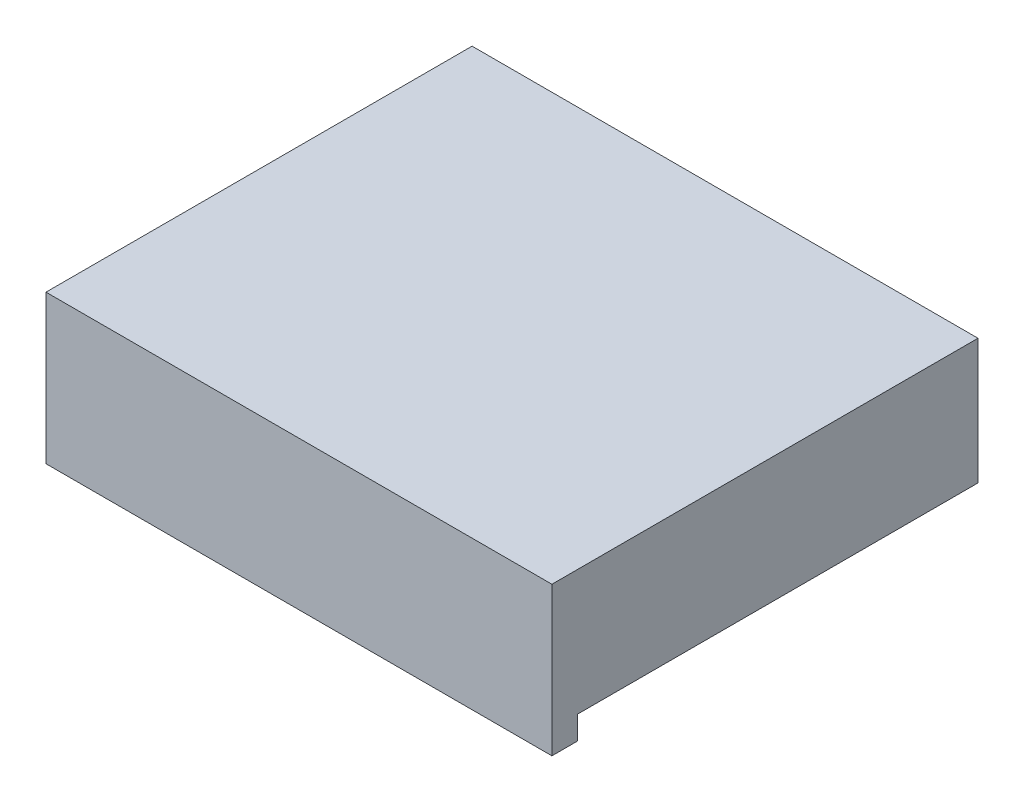
ISO-10303-21;
HEADER;
FILE_DESCRIPTION(('STEP AP214'),'2;1');
FILE_NAME('part.step','',(''),(''),'','','');
FILE_SCHEMA(('AUTOMOTIVE_DESIGN { 1 0 10303 214 1 1 1 1 }'));
ENDSEC;
DATA;
#1=APPLICATION_CONTEXT('core data for automotive mechanical design processes');
#2=APPLICATION_PROTOCOL_DEFINITION('international standard','automotive_design',2000,#1);
#3=PRODUCT_CONTEXT('',#1,'mechanical');
#4=PRODUCT('Part','Part','',(#3));
#5=PRODUCT_RELATED_PRODUCT_CATEGORY('part','',(#4));
#6=PRODUCT_DEFINITION_FORMATION('','',#4);
#7=PRODUCT_DEFINITION_CONTEXT('part definition',#1,'design');
#8=PRODUCT_DEFINITION('design','',#6,#7);
#9=PRODUCT_DEFINITION_SHAPE('','',#8);
#10=(LENGTH_UNIT() NAMED_UNIT(*) SI_UNIT(.MILLI.,.METRE.));
#11=(NAMED_UNIT(*) PLANE_ANGLE_UNIT() SI_UNIT($,.RADIAN.));
#12=(NAMED_UNIT(*) SI_UNIT($,.STERADIAN.) SOLID_ANGLE_UNIT());
#13=UNCERTAINTY_MEASURE_WITH_UNIT(LENGTH_MEASURE(1.E-05),#10,'distance_accuracy_value','');
#14=(GEOMETRIC_REPRESENTATION_CONTEXT(3) GLOBAL_UNCERTAINTY_ASSIGNED_CONTEXT((#13)) GLOBAL_UNIT_ASSIGNED_CONTEXT((#10,
#11,#12)) REPRESENTATION_CONTEXT('',''));
#15=CARTESIAN_POINT('',(0.,0.,0.));
#16=DIRECTION('',(0.,0.,1.));
#17=DIRECTION('',(1.,0.,0.));
#18=AXIS2_PLACEMENT_3D('',#15,#16,#17);
#19=CARTESIAN_POINT('',(109.,0.,0.));
#20=DIRECTION('',(0.,0.,1.));
#21=DIRECTION('',(1.,0.,0.));
#22=AXIS2_PLACEMENT_3D('',#19,#20,#21);
#23=PLANE('',#22);
#24=DIRECTION('',(0.,1.,0.));
#25=VECTOR('',#24,1.);
#26=CARTESIAN_POINT('',(0.,0.,0.));
#27=LINE('',#26,#25);
#28=CARTESIAN_POINT('',(0.,0.,0.));
#29=VERTEX_POINT('',#28);
#30=CARTESIAN_POINT('',(0.,27.,0.));
#31=VERTEX_POINT('',#30);
#32=EDGE_CURVE('E134',#29,#31,#27,.T.);
#33=ORIENTED_EDGE('',*,*,#32,.T.);
#34=DIRECTION('',(-1.,0.,0.));
#35=VECTOR('',#34,1.);
#36=CARTESIAN_POINT('',(109.,27.,0.));
#37=LINE('',#36,#35);
#38=CARTESIAN_POINT('',(109.,27.,0.));
#39=VERTEX_POINT('',#38);
#40=EDGE_CURVE('E11',#39,#31,#37,.T.);
#41=ORIENTED_EDGE('',*,*,#40,.F.);
#42=DIRECTION('',(0.,1.,0.));
#43=VECTOR('',#42,1.);
#44=CARTESIAN_POINT('',(109.,0.,0.));
#45=LINE('',#44,#43);
#46=CARTESIAN_POINT('',(109.,0.,0.));
#47=VERTEX_POINT('',#46);
#48=EDGE_CURVE('E150',#47,#39,#45,.T.);
#49=ORIENTED_EDGE('',*,*,#48,.F.);
#50=DIRECTION('',(-1.,0.,0.));
#51=VECTOR('',#50,1.);
#52=CARTESIAN_POINT('',(109.,0.,0.));
#53=LINE('',#52,#51);
#54=EDGE_CURVE('E130',#47,#29,#53,.T.);
#55=ORIENTED_EDGE('',*,*,#54,.T.);
#56=EDGE_LOOP('',(#33,#41,#49,#55));
#57=FACE_BOUND('',#56,.T.);
#58=ADVANCED_FACE('F45',(#57),#23,.F.);
#59=CARTESIAN_POINT('',(109.,27.,0.));
#60=DIRECTION('',(0.,-1.,0.));
#61=DIRECTION('',(0.,0.,-1.));
#62=AXIS2_PLACEMENT_3D('',#59,#60,#61);
#63=PLANE('',#62);
#64=DIRECTION('',(0.,0.,1.));
#65=VECTOR('',#64,1.);
#66=CARTESIAN_POINT('',(0.,27.,0.));
#67=LINE('',#66,#65);
#68=CARTESIAN_POINT('',(0.,27.,91.8));
#69=VERTEX_POINT('',#68);
#70=EDGE_CURVE('E138',#31,#69,#67,.T.);
#71=ORIENTED_EDGE('',*,*,#70,.T.);
#72=DIRECTION('',(-1.,0.,0.));
#73=VECTOR('',#72,1.);
#74=CARTESIAN_POINT('',(109.,27.,91.8));
#75=LINE('',#74,#73);
#76=CARTESIAN_POINT('',(109.,27.,91.8));
#77=VERTEX_POINT('',#76);
#78=EDGE_CURVE('E54',#77,#69,#75,.T.);
#79=ORIENTED_EDGE('',*,*,#78,.F.);
#80=DIRECTION('',(0.,0.,1.));
#81=VECTOR('',#80,1.);
#82=CARTESIAN_POINT('',(109.,27.,0.));
#83=LINE('',#82,#81);
#84=EDGE_CURVE('E99',#39,#77,#83,.T.);
#85=ORIENTED_EDGE('',*,*,#84,.F.);
#86=ORIENTED_EDGE('',*,*,#40,.T.);
#87=EDGE_LOOP('',(#71,#79,#85,#86));
#88=FACE_BOUND('',#87,.T.);
#89=ADVANCED_FACE('F178',(#88),#63,.F.);
#90=CARTESIAN_POINT('',(109.,-5.02097917348555,91.8));
#91=DIRECTION('',(0.,0.,-1.));
#92=DIRECTION('',(-1.,0.,0.));
#93=AXIS2_PLACEMENT_3D('',#90,#91,#92);
#94=PLANE('',#93);
#95=DIRECTION('',(0.,-1.,0.));
#96=VECTOR('',#95,1.);
#97=CARTESIAN_POINT('',(0.,-5.02097917348555,91.8));
#98=LINE('',#97,#96);
#99=CARTESIAN_POINT('',(0.,-5.02097917348555,91.8));
#100=VERTEX_POINT('',#99);
#101=EDGE_CURVE('E141',#69,#100,#98,.T.);
#102=ORIENTED_EDGE('',*,*,#101,.T.);
#103=DIRECTION('',(-1.,0.,0.));
#104=VECTOR('',#103,1.);
#105=CARTESIAN_POINT('',(109.,-5.02097917348555,91.8));
#106=LINE('',#105,#104);
#107=CARTESIAN_POINT('',(109.,-5.02097917348555,91.8));
#108=VERTEX_POINT('',#107);
#109=EDGE_CURVE('E123',#108,#100,#106,.T.);
#110=ORIENTED_EDGE('',*,*,#109,.F.);
#111=DIRECTION('',(0.,-1.,0.));
#112=VECTOR('',#111,1.);
#113=CARTESIAN_POINT('',(109.,-5.02097917348555,91.8));
#114=LINE('',#113,#112);
#115=EDGE_CURVE('E112',#77,#108,#114,.T.);
#116=ORIENTED_EDGE('',*,*,#115,.F.);
#117=ORIENTED_EDGE('',*,*,#78,.T.);
#118=EDGE_LOOP('',(#102,#110,#116,#117));
#119=FACE_BOUND('',#118,.T.);
#120=ADVANCED_FACE('F160',(#119),#94,.F.);
#121=CARTESIAN_POINT('',(109.,-5.02097917348555,91.8));
#122=DIRECTION('',(0.,1.,0.));
#123=DIRECTION('',(0.,0.,1.));
#124=AXIS2_PLACEMENT_3D('',#121,#122,#123);
#125=PLANE('',#124);
#126=DIRECTION('',(0.,0.,-1.));
#127=VECTOR('',#126,1.);
#128=CARTESIAN_POINT('',(0.,-5.02097917348555,91.8));
#129=LINE('',#128,#127);
#130=CARTESIAN_POINT('',(0.,-5.02097917348555,86.3));
#131=VERTEX_POINT('',#130);
#132=EDGE_CURVE('E121',#100,#131,#129,.T.);
#133=ORIENTED_EDGE('',*,*,#132,.T.);
#134=DIRECTION('',(-1.,0.,0.));
#135=VECTOR('',#134,1.);
#136=CARTESIAN_POINT('',(109.,-5.02097917348555,86.3));
#137=LINE('',#136,#135);
#138=CARTESIAN_POINT('',(109.,-5.02097917348555,86.3));
#139=VERTEX_POINT('',#138);
#140=EDGE_CURVE('E118',#139,#131,#137,.T.);
#141=ORIENTED_EDGE('',*,*,#140,.F.);
#142=DIRECTION('',(0.,0.,-1.));
#143=VECTOR('',#142,1.);
#144=CARTESIAN_POINT('',(109.,-5.02097917348555,91.8));
#145=LINE('',#144,#143);
#146=EDGE_CURVE('E106',#108,#139,#145,.T.);
#147=ORIENTED_EDGE('',*,*,#146,.F.);
#148=ORIENTED_EDGE('',*,*,#109,.T.);
#149=EDGE_LOOP('',(#133,#141,#147,#148));
#150=FACE_BOUND('',#149,.T.);
#151=ADVANCED_FACE('F119',(#150),#125,.F.);
#152=CARTESIAN_POINT('',(109.,-5.02097917348555,86.3));
#153=DIRECTION('',(0.,0.,1.));
#154=DIRECTION('',(1.,0.,0.));
#155=AXIS2_PLACEMENT_3D('',#152,#153,#154);
#156=PLANE('',#155);
#157=DIRECTION('',(0.,1.,0.));
#158=VECTOR('',#157,1.);
#159=CARTESIAN_POINT('',(0.,-5.02097917348555,86.3));
#160=LINE('',#159,#158);
#161=CARTESIAN_POINT('',(0.,0.,86.3));
#162=VERTEX_POINT('',#161);
#163=EDGE_CURVE('E85',#131,#162,#160,.T.);
#164=ORIENTED_EDGE('',*,*,#163,.T.);
#165=DIRECTION('',(-1.,0.,0.));
#166=VECTOR('',#165,1.);
#167=CARTESIAN_POINT('',(109.,0.,86.3));
#168=LINE('',#167,#166);
#169=CARTESIAN_POINT('',(109.,0.,86.3));
#170=VERTEX_POINT('',#169);
#171=EDGE_CURVE('E124',#170,#162,#168,.T.);
#172=ORIENTED_EDGE('',*,*,#171,.F.);
#173=DIRECTION('',(0.,1.,0.));
#174=VECTOR('',#173,1.);
#175=CARTESIAN_POINT('',(109.,-5.02097917348555,86.3));
#176=LINE('',#175,#174);
#177=EDGE_CURVE('E110',#139,#170,#176,.T.);
#178=ORIENTED_EDGE('',*,*,#177,.F.);
#179=ORIENTED_EDGE('',*,*,#140,.T.);
#180=EDGE_LOOP('',(#164,#172,#178,#179));
#181=FACE_BOUND('',#180,.T.);
#182=ADVANCED_FACE('F126',(#181),#156,.F.);
#183=CARTESIAN_POINT('',(109.,0.,0.));
#184=DIRECTION('',(0.,1.,0.));
#185=DIRECTION('',(0.,0.,1.));
#186=AXIS2_PLACEMENT_3D('',#183,#184,#185);
#187=PLANE('',#186);
#188=DIRECTION('',(0.,0.,-1.));
#189=VECTOR('',#188,1.);
#190=CARTESIAN_POINT('',(0.,0.,0.));
#191=LINE('',#190,#189);
#192=EDGE_CURVE('E91',#162,#29,#191,.T.);
#193=ORIENTED_EDGE('',*,*,#192,.T.);
#194=ORIENTED_EDGE('',*,*,#54,.F.);
#195=DIRECTION('',(0.,0.,-1.));
#196=VECTOR('',#195,1.);
#197=CARTESIAN_POINT('',(109.,0.,0.));
#198=LINE('',#197,#196);
#199=EDGE_CURVE('E62',#170,#47,#198,.T.);
#200=ORIENTED_EDGE('',*,*,#199,.F.);
#201=ORIENTED_EDGE('',*,*,#171,.T.);
#202=EDGE_LOOP('',(#193,#194,#200,#201));
#203=FACE_BOUND('',#202,.T.);
#204=ADVANCED_FACE('F167',(#203),#187,.F.);
#205=CARTESIAN_POINT('',(109.,0.,0.));
#206=DIRECTION('',(1.,0.,0.));
#207=DIRECTION('',(0.,0.,-1.));
#208=AXIS2_PLACEMENT_3D('',#205,#206,#207);
#209=PLANE('',#208);
#210=ORIENTED_EDGE('',*,*,#48,.T.);
#211=ORIENTED_EDGE('',*,*,#84,.T.);
#212=ORIENTED_EDGE('',*,*,#115,.T.);
#213=ORIENTED_EDGE('',*,*,#146,.T.);
#214=ORIENTED_EDGE('',*,*,#177,.T.);
#215=ORIENTED_EDGE('',*,*,#199,.T.);
#216=EDGE_LOOP('',(#210,#211,#212,#213,#214,#215));
#217=FACE_BOUND('',#216,.T.);
#218=ADVANCED_FACE('F108',(#217),#209,.T.);
#219=CARTESIAN_POINT('',(0.,0.,0.));
#220=DIRECTION('',(1.,0.,0.));
#221=DIRECTION('',(0.,0.,-1.));
#222=AXIS2_PLACEMENT_3D('',#219,#220,#221);
#223=PLANE('',#222);
#224=ORIENTED_EDGE('',*,*,#32,.F.);
#225=ORIENTED_EDGE('',*,*,#192,.F.);
#226=ORIENTED_EDGE('',*,*,#163,.F.);
#227=ORIENTED_EDGE('',*,*,#132,.F.);
#228=ORIENTED_EDGE('',*,*,#101,.F.);
#229=ORIENTED_EDGE('',*,*,#70,.F.);
#230=EDGE_LOOP('',(#224,#225,#226,#227,#228,#229));
#231=FACE_BOUND('',#230,.T.);
#232=ADVANCED_FACE('F163',(#231),#223,.F.);
#233=CLOSED_SHELL('',(#58,#89,#120,#151,#182,#204,#218,#232));
#234=MANIFOLD_SOLID_BREP('B2',#233);
#235=ADVANCED_BREP_SHAPE_REPRESENTATION('',(#18,#234),#14);
#236=SHAPE_DEFINITION_REPRESENTATION(#9,#235);
ENDSEC;
END-ISO-10303-21;
